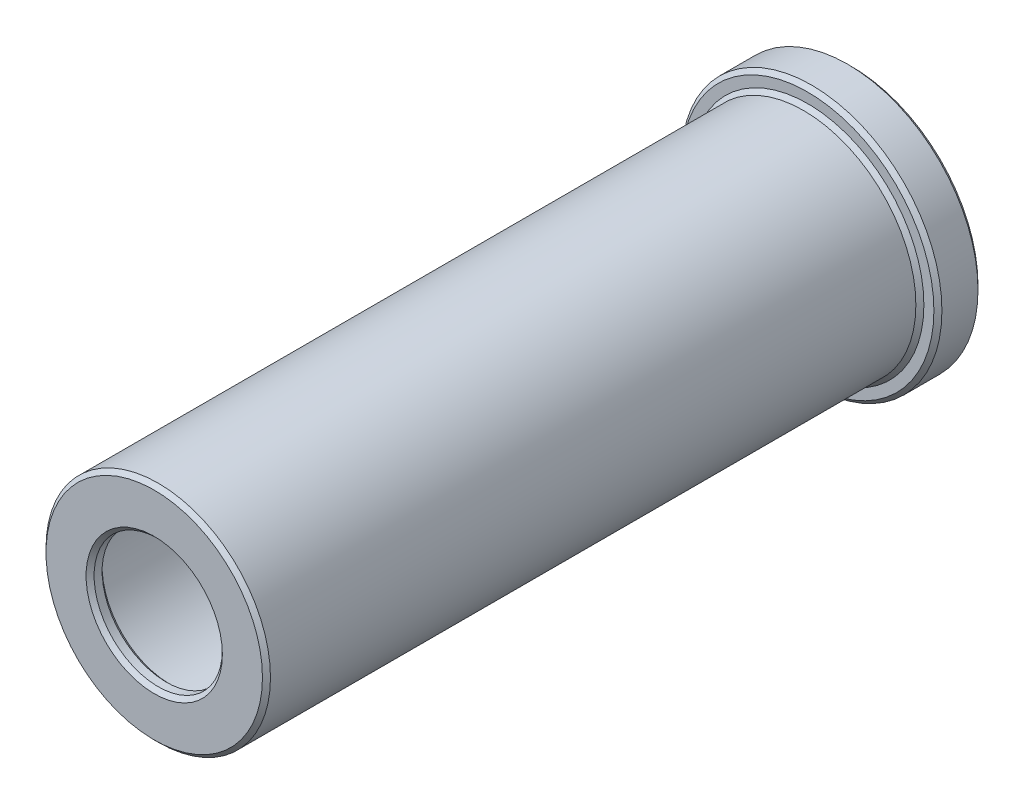
ISO-10303-21;
HEADER;
FILE_DESCRIPTION(('STEP AP214'),'2;1');
FILE_NAME('part.step','',(''),(''),'','','');
FILE_SCHEMA(('AUTOMOTIVE_DESIGN { 1 0 10303 214 1 1 1 1 }'));
ENDSEC;
DATA;
#1=APPLICATION_CONTEXT('core data for automotive mechanical design processes');
#2=APPLICATION_PROTOCOL_DEFINITION('international standard','automotive_design',2000,#1);
#3=PRODUCT_CONTEXT('',#1,'mechanical');
#4=PRODUCT('Part','Part','',(#3));
#5=PRODUCT_RELATED_PRODUCT_CATEGORY('part','',(#4));
#6=PRODUCT_DEFINITION_FORMATION('','',#4);
#7=PRODUCT_DEFINITION_CONTEXT('part definition',#1,'design');
#8=PRODUCT_DEFINITION('design','',#6,#7);
#9=PRODUCT_DEFINITION_SHAPE('','',#8);
#10=(LENGTH_UNIT() NAMED_UNIT(*) SI_UNIT(.MILLI.,.METRE.));
#11=(NAMED_UNIT(*) PLANE_ANGLE_UNIT() SI_UNIT($,.RADIAN.));
#12=(NAMED_UNIT(*) SI_UNIT($,.STERADIAN.) SOLID_ANGLE_UNIT());
#13=UNCERTAINTY_MEASURE_WITH_UNIT(LENGTH_MEASURE(1.E-05),#10,'distance_accuracy_value','');
#14=(GEOMETRIC_REPRESENTATION_CONTEXT(3) GLOBAL_UNCERTAINTY_ASSIGNED_CONTEXT((#13)) GLOBAL_UNIT_ASSIGNED_CONTEXT((#10,
#11,#12)) REPRESENTATION_CONTEXT('',''));
#15=CARTESIAN_POINT('',(0.,0.,0.));
#16=DIRECTION('',(0.,0.,1.));
#17=DIRECTION('',(1.,0.,0.));
#18=AXIS2_PLACEMENT_3D('',#15,#16,#17);
#19=CARTESIAN_POINT('',(0.,0.,0.));
#20=DIRECTION('',(0.,0.,1.));
#21=DIRECTION('',(1.,0.,0.));
#22=AXIS2_PLACEMENT_3D('',#19,#20,#21);
#23=PLANE('',#22);
#24=CARTESIAN_POINT('',(0.,0.,0.));
#25=DIRECTION('',(0.,0.,1.));
#26=DIRECTION('',(1.,0.,0.));
#27=AXIS2_PLACEMENT_3D('',#24,#25,#26);
#28=CIRCLE('',#27,14.25);
#29=CARTESIAN_POINT('',(14.25,0.,0.));
#30=VERTEX_POINT('',#29);
#31=EDGE_CURVE('E88',#30,#30,#28,.T.);
#32=ORIENTED_EDGE('',*,*,#31,.T.);
#33=EDGE_LOOP('',(#32));
#34=FACE_BOUND('',#33,.T.);
#35=CARTESIAN_POINT('',(0.,0.,0.));
#36=DIRECTION('',(0.,0.,1.));
#37=DIRECTION('',(1.,0.,0.));
#38=AXIS2_PLACEMENT_3D('',#35,#36,#37);
#39=CIRCLE('',#38,15.75);
#40=CARTESIAN_POINT('',(15.75,0.,0.));
#41=VERTEX_POINT('',#40);
#42=EDGE_CURVE('E104',#41,#41,#39,.F.);
#43=ORIENTED_EDGE('',*,*,#42,.T.);
#44=EDGE_LOOP('',(#43));
#45=FACE_BOUND('',#44,.T.);
#46=ADVANCED_FACE('F79',(#34,#45),#23,.F.);
#47=CARTESIAN_POINT('',(0.,0.,85.));
#48=DIRECTION('',(0.,0.,-1.));
#49=DIRECTION('',(-1.,0.,0.));
#50=AXIS2_PLACEMENT_3D('',#47,#48,#49);
#51=CYLINDRICAL_SURFACE('',#50,14.);
#52=CARTESIAN_POINT('',(0.,0.,86.5));
#53=DIRECTION('',(0.,0.,1.));
#54=DIRECTION('',(1.,0.,0.));
#55=AXIS2_PLACEMENT_3D('',#52,#53,#54);
#56=CIRCLE('',#55,14.);
#57=CARTESIAN_POINT('',(14.,0.,86.5));
#58=VERTEX_POINT('',#57);
#59=EDGE_CURVE('E116',#58,#58,#56,.F.);
#60=ORIENTED_EDGE('',*,*,#59,.T.);
#61=EDGE_LOOP('',(#60));
#62=FACE_BOUND('',#61,.T.);
#63=CARTESIAN_POINT('',(0.,0.,6.00000000000001));
#64=DIRECTION('',(0.,0.,1.));
#65=DIRECTION('',(1.,0.,0.));
#66=AXIS2_PLACEMENT_3D('',#63,#64,#65);
#67=CIRCLE('',#66,14.);
#68=CARTESIAN_POINT('',(14.,0.,6.00000000000001));
#69=VERTEX_POINT('',#68);
#70=EDGE_CURVE('E120',#69,#69,#67,.T.);
#71=ORIENTED_EDGE('',*,*,#70,.T.);
#72=EDGE_LOOP('',(#71));
#73=FACE_BOUND('',#72,.T.);
#74=ADVANCED_FACE('F175',(#62,#73),#51,.T.);
#75=CARTESIAN_POINT('',(0.,0.,85.));
#76=DIRECTION('',(0.,0.,-1.));
#77=DIRECTION('',(-1.,0.,0.));
#78=AXIS2_PLACEMENT_3D('',#75,#76,#77);
#79=CYLINDRICAL_SURFACE('',#78,12.5);
#80=CARTESIAN_POINT('',(0.,0.,3.03108891324556));
#81=DIRECTION('',(0.,0.,1.));
#82=DIRECTION('',(1.,0.,0.));
#83=AXIS2_PLACEMENT_3D('',#80,#81,#82);
#84=CIRCLE('',#83,12.5);
#85=CARTESIAN_POINT('',(12.5,0.,3.03108891324556));
#86=VERTEX_POINT('',#85);
#87=EDGE_CURVE('E12',#86,#86,#84,.F.);
#88=ORIENTED_EDGE('',*,*,#87,.T.);
#89=EDGE_LOOP('',(#88));
#90=FACE_BOUND('',#89,.T.);
#91=CARTESIAN_POINT('',(0.,0.,84.));
#92=DIRECTION('',(0.,0.,1.));
#93=DIRECTION('',(1.,0.,0.));
#94=AXIS2_PLACEMENT_3D('',#91,#92,#93);
#95=CIRCLE('',#94,12.5);
#96=CARTESIAN_POINT('',(12.5,0.,84.));
#97=VERTEX_POINT('',#96);
#98=EDGE_CURVE('E148',#97,#97,#95,.T.);
#99=ORIENTED_EDGE('',*,*,#98,.T.);
#100=EDGE_LOOP('',(#99));
#101=FACE_BOUND('',#100,.T.);
#102=ADVANCED_FACE('F153',(#90,#101),#79,.F.);
#103=CARTESIAN_POINT('',(0.,0.,5.5));
#104=DIRECTION('',(0.,0.,1.));
#105=DIRECTION('',(1.,0.,0.));
#106=AXIS2_PLACEMENT_3D('',#103,#104,#105);
#107=PLANE('',#106);
#108=CARTESIAN_POINT('',(0.,0.,5.5));
#109=DIRECTION('',(0.,0.,1.));
#110=DIRECTION('',(1.,0.,0.));
#111=AXIS2_PLACEMENT_3D('',#108,#109,#110);
#112=CIRCLE('',#111,14.5);
#113=CARTESIAN_POINT('',(14.5,0.,5.5));
#114=VERTEX_POINT('',#113);
#115=EDGE_CURVE('E93',#114,#114,#112,.F.);
#116=ORIENTED_EDGE('',*,*,#115,.T.);
#117=EDGE_LOOP('',(#116));
#118=FACE_BOUND('',#117,.T.);
#119=CARTESIAN_POINT('',(0.,0.,5.5));
#120=DIRECTION('',(0.,0.,1.));
#121=DIRECTION('',(1.,0.,0.));
#122=AXIS2_PLACEMENT_3D('',#119,#120,#121);
#123=CIRCLE('',#122,15.75);
#124=CARTESIAN_POINT('',(15.75,0.,5.5));
#125=VERTEX_POINT('',#124);
#126=EDGE_CURVE('E98',#125,#125,#123,.T.);
#127=ORIENTED_EDGE('',*,*,#126,.T.);
#128=EDGE_LOOP('',(#127));
#129=FACE_BOUND('',#128,.T.);
#130=ADVANCED_FACE('F186',(#118,#129),#107,.T.);
#131=CARTESIAN_POINT('',(0.,0.,5.5));
#132=DIRECTION('',(0.,0.,-1.));
#133=DIRECTION('',(-1.,0.,0.));
#134=AXIS2_PLACEMENT_3D('',#131,#132,#133);
#135=CYLINDRICAL_SURFACE('',#134,16.25);
#136=CARTESIAN_POINT('',(0.,0.,0.5));
#137=DIRECTION('',(0.,0.,1.));
#138=DIRECTION('',(1.,0.,0.));
#139=AXIS2_PLACEMENT_3D('',#136,#137,#138);
#140=CIRCLE('',#139,16.25);
#141=CARTESIAN_POINT('',(16.25,0.,0.5));
#142=VERTEX_POINT('',#141);
#143=EDGE_CURVE('E108',#142,#142,#140,.T.);
#144=ORIENTED_EDGE('',*,*,#143,.T.);
#145=EDGE_LOOP('',(#144));
#146=FACE_BOUND('',#145,.T.);
#147=CARTESIAN_POINT('',(0.,0.,5.));
#148=DIRECTION('',(0.,0.,1.));
#149=DIRECTION('',(1.,0.,0.));
#150=AXIS2_PLACEMENT_3D('',#147,#148,#149);
#151=CIRCLE('',#150,16.25);
#152=CARTESIAN_POINT('',(16.25,0.,5.));
#153=VERTEX_POINT('',#152);
#154=EDGE_CURVE('E112',#153,#153,#151,.F.);
#155=ORIENTED_EDGE('',*,*,#154,.T.);
#156=EDGE_LOOP('',(#155));
#157=FACE_BOUND('',#156,.T.);
#158=ADVANCED_FACE('F187',(#146,#157),#135,.T.);
#159=CARTESIAN_POINT('',(0.,0.,85.));
#160=DIRECTION('',(0.,0.,1.));
#161=DIRECTION('',(1.,0.,0.));
#162=AXIS2_PLACEMENT_3D('',#159,#160,#161);
#163=PLANE('',#162);
#164=CARTESIAN_POINT('',(0.,0.,85.));
#165=DIRECTION('',(0.,0.,1.));
#166=DIRECTION('',(1.,0.,0.));
#167=AXIS2_PLACEMENT_3D('',#164,#165,#166);
#168=CIRCLE('',#167,11.5);
#169=CARTESIAN_POINT('',(11.5,0.,85.));
#170=VERTEX_POINT('',#169);
#171=EDGE_CURVE('E140',#170,#170,#168,.F.);
#172=ORIENTED_EDGE('',*,*,#171,.T.);
#173=EDGE_LOOP('',(#172));
#174=FACE_BOUND('',#173,.T.);
#175=CARTESIAN_POINT('',(0.,0.,85.));
#176=DIRECTION('',(0.,0.,1.));
#177=DIRECTION('',(1.,0.,0.));
#178=AXIS2_PLACEMENT_3D('',#175,#176,#177);
#179=CIRCLE('',#178,8.5);
#180=CARTESIAN_POINT('',(8.5,0.,85.));
#181=VERTEX_POINT('',#180);
#182=EDGE_CURVE('E144',#181,#181,#179,.T.);
#183=ORIENTED_EDGE('',*,*,#182,.T.);
#184=EDGE_LOOP('',(#183));
#185=FACE_BOUND('',#184,.T.);
#186=ADVANCED_FACE('F190',(#174,#185),#163,.F.);
#187=CARTESIAN_POINT('',(0.,0.,87.));
#188=DIRECTION('',(0.,0.,1.));
#189=DIRECTION('',(1.,0.,0.));
#190=AXIS2_PLACEMENT_3D('',#187,#188,#189);
#191=PLANE('',#190);
#192=CARTESIAN_POINT('',(0.,0.,87.));
#193=DIRECTION('',(0.,0.,1.));
#194=DIRECTION('',(1.,0.,0.));
#195=AXIS2_PLACEMENT_3D('',#192,#193,#194);
#196=CIRCLE('',#195,8.5);
#197=CARTESIAN_POINT('',(8.5,0.,87.));
#198=VERTEX_POINT('',#197);
#199=EDGE_CURVE('E124',#198,#198,#196,.F.);
#200=ORIENTED_EDGE('',*,*,#199,.T.);
#201=EDGE_LOOP('',(#200));
#202=FACE_BOUND('',#201,.T.);
#203=CARTESIAN_POINT('',(0.,0.,87.));
#204=DIRECTION('',(0.,0.,1.));
#205=DIRECTION('',(1.,0.,0.));
#206=AXIS2_PLACEMENT_3D('',#203,#204,#205);
#207=CIRCLE('',#206,13.5);
#208=CARTESIAN_POINT('',(13.5,0.,87.));
#209=VERTEX_POINT('',#208);
#210=EDGE_CURVE('E128',#209,#209,#207,.T.);
#211=ORIENTED_EDGE('',*,*,#210,.T.);
#212=EDGE_LOOP('',(#211));
#213=FACE_BOUND('',#212,.T.);
#214=ADVANCED_FACE('F168',(#202,#213),#191,.T.);
#215=CARTESIAN_POINT('',(0.,0.,87.));
#216=DIRECTION('',(0.,0.,-1.));
#217=DIRECTION('',(-1.,0.,0.));
#218=AXIS2_PLACEMENT_3D('',#215,#216,#217);
#219=CYLINDRICAL_SURFACE('',#218,8.);
#220=CARTESIAN_POINT('',(0.,0.,85.5));
#221=DIRECTION('',(0.,0.,1.));
#222=DIRECTION('',(1.,0.,0.));
#223=AXIS2_PLACEMENT_3D('',#220,#221,#222);
#224=CIRCLE('',#223,8.);
#225=CARTESIAN_POINT('',(8.,0.,85.5));
#226=VERTEX_POINT('',#225);
#227=EDGE_CURVE('E132',#226,#226,#224,.F.);
#228=ORIENTED_EDGE('',*,*,#227,.T.);
#229=EDGE_LOOP('',(#228));
#230=FACE_BOUND('',#229,.T.);
#231=CARTESIAN_POINT('',(0.,0.,86.5));
#232=DIRECTION('',(0.,0.,1.));
#233=DIRECTION('',(1.,0.,0.));
#234=AXIS2_PLACEMENT_3D('',#231,#232,#233);
#235=CIRCLE('',#234,8.);
#236=CARTESIAN_POINT('',(8.,0.,86.5));
#237=VERTEX_POINT('',#236);
#238=EDGE_CURVE('E136',#237,#237,#235,.T.);
#239=ORIENTED_EDGE('',*,*,#238,.T.);
#240=EDGE_LOOP('',(#239));
#241=FACE_BOUND('',#240,.T.);
#242=ADVANCED_FACE('F158',(#230,#241),#219,.F.);
#243=CARTESIAN_POINT('',(0.,0.,84.));
#244=DIRECTION('',(0.,0.,-1.));
#245=DIRECTION('',(-1.,0.,0.));
#246=AXIS2_PLACEMENT_3D('',#243,#244,#245);
#247=CONICAL_SURFACE('',#246,12.5,0.785398163397448);
#248=ORIENTED_EDGE('',*,*,#171,.F.);
#249=EDGE_LOOP('',(#248));
#250=FACE_BOUND('',#249,.T.);
#251=ORIENTED_EDGE('',*,*,#98,.F.);
#252=EDGE_LOOP('',(#251));
#253=FACE_BOUND('',#252,.T.);
#254=ADVANCED_FACE('F155',(#250,#253),#247,.F.);
#255=CARTESIAN_POINT('',(0.,0.,85.));
#256=DIRECTION('',(0.,0.,-1.));
#257=DIRECTION('',(-1.,0.,0.));
#258=AXIS2_PLACEMENT_3D('',#255,#256,#257);
#259=CONICAL_SURFACE('',#258,8.5,0.785398163397448);
#260=ORIENTED_EDGE('',*,*,#227,.F.);
#261=EDGE_LOOP('',(#260));
#262=FACE_BOUND('',#261,.T.);
#263=ORIENTED_EDGE('',*,*,#182,.F.);
#264=EDGE_LOOP('',(#263));
#265=FACE_BOUND('',#264,.T.);
#266=ADVANCED_FACE('F157',(#262,#265),#259,.F.);
#267=CARTESIAN_POINT('',(0.,0.,86.5));
#268=DIRECTION('',(0.,0.,1.));
#269=DIRECTION('',(1.,0.,0.));
#270=AXIS2_PLACEMENT_3D('',#267,#268,#269);
#271=CONICAL_SURFACE('',#270,8.,0.785398163397448);
#272=ORIENTED_EDGE('',*,*,#199,.F.);
#273=EDGE_LOOP('',(#272));
#274=FACE_BOUND('',#273,.T.);
#275=ORIENTED_EDGE('',*,*,#238,.F.);
#276=EDGE_LOOP('',(#275));
#277=FACE_BOUND('',#276,.T.);
#278=ADVANCED_FACE('F165',(#274,#277),#271,.F.);
#279=CARTESIAN_POINT('',(0.,0.,87.));
#280=DIRECTION('',(0.,0.,-1.));
#281=DIRECTION('',(-1.,0.,0.));
#282=AXIS2_PLACEMENT_3D('',#279,#280,#281);
#283=CONICAL_SURFACE('',#282,13.5,0.785398163397448);
#284=ORIENTED_EDGE('',*,*,#59,.F.);
#285=EDGE_LOOP('',(#284));
#286=FACE_BOUND('',#285,.T.);
#287=ORIENTED_EDGE('',*,*,#210,.F.);
#288=EDGE_LOOP('',(#287));
#289=FACE_BOUND('',#288,.T.);
#290=ADVANCED_FACE('F206',(#286,#289),#283,.T.);
#291=CARTESIAN_POINT('',(0.,0.,0.5));
#292=DIRECTION('',(0.,0.,1.));
#293=DIRECTION('',(1.,0.,0.));
#294=AXIS2_PLACEMENT_3D('',#291,#292,#293);
#295=CONICAL_SURFACE('',#294,16.25,0.785398163397448);
#296=ORIENTED_EDGE('',*,*,#42,.F.);
#297=EDGE_LOOP('',(#296));
#298=FACE_BOUND('',#297,.T.);
#299=ORIENTED_EDGE('',*,*,#143,.F.);
#300=EDGE_LOOP('',(#299));
#301=FACE_BOUND('',#300,.T.);
#302=ADVANCED_FACE('F208',(#298,#301),#295,.T.);
#303=CARTESIAN_POINT('',(0.,0.,6.00000000000001));
#304=DIRECTION('',(0.,0.,-1.));
#305=DIRECTION('',(-1.,0.,0.));
#306=AXIS2_PLACEMENT_3D('',#303,#304,#305);
#307=CONICAL_SURFACE('',#306,14.,0.785398163397448);
#308=ORIENTED_EDGE('',*,*,#115,.F.);
#309=EDGE_LOOP('',(#308));
#310=FACE_BOUND('',#309,.T.);
#311=ORIENTED_EDGE('',*,*,#70,.F.);
#312=EDGE_LOOP('',(#311));
#313=FACE_BOUND('',#312,.T.);
#314=ADVANCED_FACE('F215',(#310,#313),#307,.T.);
#315=CARTESIAN_POINT('',(0.,0.,5.5));
#316=DIRECTION('',(0.,0.,-1.));
#317=DIRECTION('',(-1.,0.,0.));
#318=AXIS2_PLACEMENT_3D('',#315,#316,#317);
#319=CONICAL_SURFACE('',#318,15.75,0.785398163397448);
#320=ORIENTED_EDGE('',*,*,#154,.F.);
#321=EDGE_LOOP('',(#320));
#322=FACE_BOUND('',#321,.T.);
#323=ORIENTED_EDGE('',*,*,#126,.F.);
#324=EDGE_LOOP('',(#323));
#325=FACE_BOUND('',#324,.T.);
#326=ADVANCED_FACE('F234',(#322,#325),#319,.T.);
#327=CARTESIAN_POINT('',(0.,0.,0.));
#328=DIRECTION('',(0.,0.,-1.));
#329=DIRECTION('',(-1.,0.,0.));
#330=AXIS2_PLACEMENT_3D('',#327,#328,#329);
#331=CONICAL_SURFACE('',#330,14.25,0.523598775598299);
#332=ORIENTED_EDGE('',*,*,#87,.F.);
#333=EDGE_LOOP('',(#332));
#334=FACE_BOUND('',#333,.T.);
#335=ORIENTED_EDGE('',*,*,#31,.F.);
#336=EDGE_LOOP('',(#335));
#337=FACE_BOUND('',#336,.T.);
#338=ADVANCED_FACE('F82',(#334,#337),#331,.F.);
#339=CLOSED_SHELL('',(#46,#74,#102,#130,#158,#186,#214,#242,#254,#266,#278,#290,#302,#314,#326,#338));
#340=MANIFOLD_SOLID_BREP('B2',#339);
#341=ADVANCED_BREP_SHAPE_REPRESENTATION('',(#18,#340),#14);
#342=SHAPE_DEFINITION_REPRESENTATION(#9,#341);
ENDSEC;
END-ISO-10303-21;
